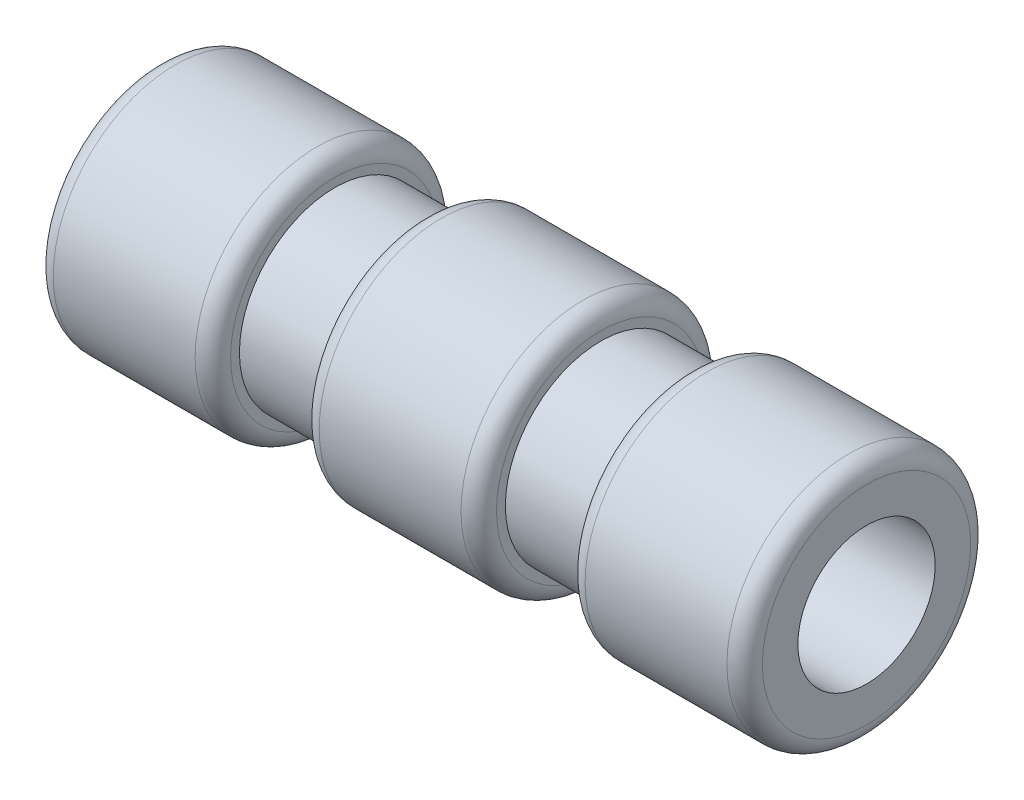
ISO-10303-21;
HEADER;
FILE_DESCRIPTION(('STEP AP214'),'2;1');
FILE_NAME('part.step','',(''),(''),'','','');
FILE_SCHEMA(('AUTOMOTIVE_DESIGN { 1 0 10303 214 1 1 1 1 }'));
ENDSEC;
DATA;
#1=APPLICATION_CONTEXT('core data for automotive mechanical design processes');
#2=APPLICATION_PROTOCOL_DEFINITION('international standard','automotive_design',2000,#1);
#3=PRODUCT_CONTEXT('',#1,'mechanical');
#4=PRODUCT('Part','Part','',(#3));
#5=PRODUCT_RELATED_PRODUCT_CATEGORY('part','',(#4));
#6=PRODUCT_DEFINITION_FORMATION('','',#4);
#7=PRODUCT_DEFINITION_CONTEXT('part definition',#1,'design');
#8=PRODUCT_DEFINITION('design','',#6,#7);
#9=PRODUCT_DEFINITION_SHAPE('','',#8);
#10=(LENGTH_UNIT() NAMED_UNIT(*) SI_UNIT(.MILLI.,.METRE.));
#11=(NAMED_UNIT(*) PLANE_ANGLE_UNIT() SI_UNIT($,.RADIAN.));
#12=(NAMED_UNIT(*) SI_UNIT($,.STERADIAN.) SOLID_ANGLE_UNIT());
#13=UNCERTAINTY_MEASURE_WITH_UNIT(LENGTH_MEASURE(1.E-05),#10,'distance_accuracy_value','');
#14=(GEOMETRIC_REPRESENTATION_CONTEXT(3) GLOBAL_UNCERTAINTY_ASSIGNED_CONTEXT((#13)) GLOBAL_UNIT_ASSIGNED_CONTEXT((#10,
#11,#12)) REPRESENTATION_CONTEXT('',''));
#15=CARTESIAN_POINT('',(0.,0.,0.));
#16=DIRECTION('',(0.,0.,1.));
#17=DIRECTION('',(1.,0.,0.));
#18=AXIS2_PLACEMENT_3D('',#15,#16,#17);
#19=CARTESIAN_POINT('',(100.,0.,-19.3760634048209));
#20=DIRECTION('',(-1.,0.,0.));
#21=DIRECTION('',(0.,0.,1.));
#22=AXIS2_PLACEMENT_3D('',#19,#20,#21);
#23=PLANE('',#22);
#24=CARTESIAN_POINT('',(100.,0.,0.));
#25=DIRECTION('',(-1.,0.,0.));
#26=DIRECTION('',(0.,0.,1.));
#27=AXIS2_PLACEMENT_3D('',#24,#25,#26);
#28=CIRCLE('',#27,29.3760634048209);
#29=CARTESIAN_POINT('',(100.,0.,29.3760634048209));
#30=VERTEX_POINT('',#29);
#31=EDGE_CURVE('E10',#30,#30,#28,.F.);
#32=ORIENTED_EDGE('',*,*,#31,.T.);
#33=EDGE_LOOP('',(#32));
#34=FACE_BOUND('',#33,.T.);
#35=CARTESIAN_POINT('',(100.,0.,0.));
#36=DIRECTION('',(-1.,0.,0.));
#37=DIRECTION('',(0.,0.,1.));
#38=AXIS2_PLACEMENT_3D('',#35,#36,#37);
#39=CIRCLE('',#38,19.3760634048209);
#40=CARTESIAN_POINT('',(100.,0.,19.3760634048209));
#41=VERTEX_POINT('',#40);
#42=EDGE_CURVE('E116',#41,#41,#39,.T.);
#43=ORIENTED_EDGE('',*,*,#42,.T.);
#44=EDGE_LOOP('',(#43));
#45=FACE_BOUND('',#44,.T.);
#46=ADVANCED_FACE('F40',(#34,#45),#23,.F.);
#47=CARTESIAN_POINT('',(-168.854447157283,0.,0.));
#48=DIRECTION('',(-1.,0.,0.));
#49=DIRECTION('',(0.,0.,1.));
#50=AXIS2_PLACEMENT_3D('',#47,#48,#49);
#51=CYLINDRICAL_SURFACE('',#50,34.3760634048209);
#52=CARTESIAN_POINT('',(55.,0.,0.));
#53=DIRECTION('',(1.,0.,0.));
#54=DIRECTION('',(0.,0.,-1.));
#55=AXIS2_PLACEMENT_3D('',#52,#53,#54);
#56=CIRCLE('',#55,34.3760634048209);
#57=CARTESIAN_POINT('',(55.,0.,-34.3760634048209));
#58=VERTEX_POINT('',#57);
#59=EDGE_CURVE('E48',#58,#58,#56,.T.);
#60=ORIENTED_EDGE('',*,*,#59,.T.);
#61=EDGE_LOOP('',(#60));
#62=FACE_BOUND('',#61,.T.);
#63=CARTESIAN_POINT('',(95.,0.,0.));
#64=DIRECTION('',(-1.,0.,0.));
#65=DIRECTION('',(0.,0.,1.));
#66=AXIS2_PLACEMENT_3D('',#63,#64,#65);
#67=CIRCLE('',#66,34.3760634048209);
#68=CARTESIAN_POINT('',(95.,0.,34.3760634048209));
#69=VERTEX_POINT('',#68);
#70=EDGE_CURVE('E53',#69,#69,#67,.T.);
#71=ORIENTED_EDGE('',*,*,#70,.T.);
#72=EDGE_LOOP('',(#71));
#73=FACE_BOUND('',#72,.T.);
#74=ADVANCED_FACE('F142',(#62,#73),#51,.T.);
#75=CARTESIAN_POINT('',(50.,0.,-34.3760634048209));
#76=DIRECTION('',(1.,0.,0.));
#77=DIRECTION('',(0.,0.,-1.));
#78=AXIS2_PLACEMENT_3D('',#75,#76,#77);
#79=PLANE('',#78);
#80=CARTESIAN_POINT('',(50.,0.,0.));
#81=DIRECTION('',(1.,0.,0.));
#82=DIRECTION('',(0.,0.,-1.));
#83=AXIS2_PLACEMENT_3D('',#80,#81,#82);
#84=CIRCLE('',#83,29.3760634048209);
#85=CARTESIAN_POINT('',(50.,0.,-29.3760634048209));
#86=VERTEX_POINT('',#85);
#87=EDGE_CURVE('E58',#86,#86,#84,.F.);
#88=ORIENTED_EDGE('',*,*,#87,.T.);
#89=EDGE_LOOP('',(#88));
#90=FACE_BOUND('',#89,.T.);
#91=CARTESIAN_POINT('',(50.,0.,0.));
#92=DIRECTION('',(-1.,0.,0.));
#93=DIRECTION('',(0.,0.,1.));
#94=AXIS2_PLACEMENT_3D('',#91,#92,#93);
#95=CIRCLE('',#94,26.8760634048209);
#96=CARTESIAN_POINT('',(50.,0.,26.8760634048209));
#97=VERTEX_POINT('',#96);
#98=EDGE_CURVE('E96',#97,#97,#95,.T.);
#99=ORIENTED_EDGE('',*,*,#98,.F.);
#100=EDGE_LOOP('',(#99));
#101=FACE_BOUND('',#100,.T.);
#102=ADVANCED_FACE('F148',(#90,#101),#79,.F.);
#103=CARTESIAN_POINT('',(-168.854447157283,0.,0.));
#104=DIRECTION('',(-1.,0.,0.));
#105=DIRECTION('',(0.,0.,1.));
#106=AXIS2_PLACEMENT_3D('',#103,#104,#105);
#107=CYLINDRICAL_SURFACE('',#106,26.8760634048209);
#108=CARTESIAN_POINT('',(25.,0.,0.));
#109=DIRECTION('',(-1.,0.,0.));
#110=DIRECTION('',(0.,0.,1.));
#111=AXIS2_PLACEMENT_3D('',#108,#109,#110);
#112=CIRCLE('',#111,26.8760634048209);
#113=CARTESIAN_POINT('',(25.,0.,26.8760634048209));
#114=VERTEX_POINT('',#113);
#115=EDGE_CURVE('E100',#114,#114,#112,.T.);
#116=ORIENTED_EDGE('',*,*,#115,.F.);
#117=EDGE_LOOP('',(#116));
#118=FACE_BOUND('',#117,.T.);
#119=ORIENTED_EDGE('',*,*,#98,.T.);
#120=EDGE_LOOP('',(#119));
#121=FACE_BOUND('',#120,.T.);
#122=ADVANCED_FACE('F178',(#118,#121),#107,.T.);
#123=CARTESIAN_POINT('',(25.,0.,-26.8760634048209));
#124=DIRECTION('',(-1.,0.,0.));
#125=DIRECTION('',(0.,0.,1.));
#126=AXIS2_PLACEMENT_3D('',#123,#124,#125);
#127=PLANE('',#126);
#128=CARTESIAN_POINT('',(25.,0.,0.));
#129=DIRECTION('',(-1.,0.,0.));
#130=DIRECTION('',(0.,0.,1.));
#131=AXIS2_PLACEMENT_3D('',#128,#129,#130);
#132=CIRCLE('',#131,29.3760634048209);
#133=CARTESIAN_POINT('',(25.,0.,29.3760634048209));
#134=VERTEX_POINT('',#133);
#135=EDGE_CURVE('E64',#134,#134,#132,.F.);
#136=ORIENTED_EDGE('',*,*,#135,.T.);
#137=EDGE_LOOP('',(#136));
#138=FACE_BOUND('',#137,.T.);
#139=ORIENTED_EDGE('',*,*,#115,.T.);
#140=EDGE_LOOP('',(#139));
#141=FACE_BOUND('',#140,.T.);
#142=ADVANCED_FACE('F182',(#138,#141),#127,.F.);
#143=CARTESIAN_POINT('',(-168.854447157283,0.,0.));
#144=DIRECTION('',(-1.,0.,0.));
#145=DIRECTION('',(0.,0.,1.));
#146=AXIS2_PLACEMENT_3D('',#143,#144,#145);
#147=CYLINDRICAL_SURFACE('',#146,34.3760634048209);
#148=CARTESIAN_POINT('',(-20.,0.,0.));
#149=DIRECTION('',(1.,0.,0.));
#150=DIRECTION('',(0.,0.,-1.));
#151=AXIS2_PLACEMENT_3D('',#148,#149,#150);
#152=CIRCLE('',#151,34.3760634048209);
#153=CARTESIAN_POINT('',(-20.,0.,-34.3760634048209));
#154=VERTEX_POINT('',#153);
#155=EDGE_CURVE('E68',#154,#154,#152,.T.);
#156=ORIENTED_EDGE('',*,*,#155,.T.);
#157=EDGE_LOOP('',(#156));
#158=FACE_BOUND('',#157,.T.);
#159=CARTESIAN_POINT('',(20.,0.,0.));
#160=DIRECTION('',(-1.,0.,0.));
#161=DIRECTION('',(0.,0.,1.));
#162=AXIS2_PLACEMENT_3D('',#159,#160,#161);
#163=CIRCLE('',#162,34.3760634048209);
#164=CARTESIAN_POINT('',(20.,0.,34.3760634048209));
#165=VERTEX_POINT('',#164);
#166=EDGE_CURVE('E72',#165,#165,#163,.T.);
#167=ORIENTED_EDGE('',*,*,#166,.T.);
#168=EDGE_LOOP('',(#167));
#169=FACE_BOUND('',#168,.T.);
#170=ADVANCED_FACE('F190',(#158,#169),#147,.T.);
#171=CARTESIAN_POINT('',(-25.,0.,-26.8760634048209));
#172=DIRECTION('',(1.,0.,0.));
#173=DIRECTION('',(0.,0.,-1.));
#174=AXIS2_PLACEMENT_3D('',#171,#172,#173);
#175=PLANE('',#174);
#176=CARTESIAN_POINT('',(-25.,0.,0.));
#177=DIRECTION('',(1.,0.,0.));
#178=DIRECTION('',(0.,0.,-1.));
#179=AXIS2_PLACEMENT_3D('',#176,#177,#178);
#180=CIRCLE('',#179,29.3760634048209);
#181=CARTESIAN_POINT('',(-25.,0.,-29.3760634048209));
#182=VERTEX_POINT('',#181);
#183=EDGE_CURVE('E76',#182,#182,#180,.F.);
#184=ORIENTED_EDGE('',*,*,#183,.T.);
#185=EDGE_LOOP('',(#184));
#186=FACE_BOUND('',#185,.T.);
#187=CARTESIAN_POINT('',(-25.,0.,0.));
#188=DIRECTION('',(-1.,0.,0.));
#189=DIRECTION('',(0.,0.,1.));
#190=AXIS2_PLACEMENT_3D('',#187,#188,#189);
#191=CIRCLE('',#190,26.8760634048209);
#192=CARTESIAN_POINT('',(-25.,0.,26.8760634048209));
#193=VERTEX_POINT('',#192);
#194=EDGE_CURVE('E104',#193,#193,#191,.T.);
#195=ORIENTED_EDGE('',*,*,#194,.F.);
#196=EDGE_LOOP('',(#195));
#197=FACE_BOUND('',#196,.T.);
#198=ADVANCED_FACE('F197',(#186,#197),#175,.F.);
#199=CARTESIAN_POINT('',(-168.854447157283,0.,0.));
#200=DIRECTION('',(-1.,0.,0.));
#201=DIRECTION('',(0.,0.,1.));
#202=AXIS2_PLACEMENT_3D('',#199,#200,#201);
#203=CYLINDRICAL_SURFACE('',#202,26.8760634048209);
#204=CARTESIAN_POINT('',(-50.,0.,0.));
#205=DIRECTION('',(-1.,0.,0.));
#206=DIRECTION('',(0.,0.,1.));
#207=AXIS2_PLACEMENT_3D('',#204,#205,#206);
#208=CIRCLE('',#207,26.8760634048209);
#209=CARTESIAN_POINT('',(-50.,0.,26.8760634048209));
#210=VERTEX_POINT('',#209);
#211=EDGE_CURVE('E108',#210,#210,#208,.T.);
#212=ORIENTED_EDGE('',*,*,#211,.F.);
#213=EDGE_LOOP('',(#212));
#214=FACE_BOUND('',#213,.T.);
#215=ORIENTED_EDGE('',*,*,#194,.T.);
#216=EDGE_LOOP('',(#215));
#217=FACE_BOUND('',#216,.T.);
#218=ADVANCED_FACE('F201',(#214,#217),#203,.T.);
#219=CARTESIAN_POINT('',(-50.,0.,-34.3760634048209));
#220=DIRECTION('',(-1.,0.,0.));
#221=DIRECTION('',(0.,0.,1.));
#222=AXIS2_PLACEMENT_3D('',#219,#220,#221);
#223=PLANE('',#222);
#224=CARTESIAN_POINT('',(-50.,0.,0.));
#225=DIRECTION('',(-1.,0.,0.));
#226=DIRECTION('',(0.,0.,1.));
#227=AXIS2_PLACEMENT_3D('',#224,#225,#226);
#228=CIRCLE('',#227,29.3760634048209);
#229=CARTESIAN_POINT('',(-50.,0.,29.3760634048209));
#230=VERTEX_POINT('',#229);
#231=EDGE_CURVE('E84',#230,#230,#228,.F.);
#232=ORIENTED_EDGE('',*,*,#231,.T.);
#233=EDGE_LOOP('',(#232));
#234=FACE_BOUND('',#233,.T.);
#235=ORIENTED_EDGE('',*,*,#211,.T.);
#236=EDGE_LOOP('',(#235));
#237=FACE_BOUND('',#236,.T.);
#238=ADVANCED_FACE('F138',(#234,#237),#223,.F.);
#239=CARTESIAN_POINT('',(-168.854447157283,0.,0.));
#240=DIRECTION('',(-1.,0.,0.));
#241=DIRECTION('',(0.,0.,1.));
#242=AXIS2_PLACEMENT_3D('',#239,#240,#241);
#243=CYLINDRICAL_SURFACE('',#242,34.3760634048209);
#244=CARTESIAN_POINT('',(-55.,0.,0.));
#245=DIRECTION('',(-1.,0.,0.));
#246=DIRECTION('',(0.,0.,1.));
#247=AXIS2_PLACEMENT_3D('',#244,#245,#246);
#248=CIRCLE('',#247,34.3760634048209);
#249=CARTESIAN_POINT('',(-55.,0.,34.3760634048209));
#250=VERTEX_POINT('',#249);
#251=EDGE_CURVE('E88',#250,#250,#248,.T.);
#252=ORIENTED_EDGE('',*,*,#251,.T.);
#253=EDGE_LOOP('',(#252));
#254=FACE_BOUND('',#253,.T.);
#255=CARTESIAN_POINT('',(-95.,0.,0.));
#256=DIRECTION('',(1.,0.,0.));
#257=DIRECTION('',(0.,0.,-1.));
#258=AXIS2_PLACEMENT_3D('',#255,#256,#257);
#259=CIRCLE('',#258,34.3760634048209);
#260=CARTESIAN_POINT('',(-95.,0.,-34.3760634048209));
#261=VERTEX_POINT('',#260);
#262=EDGE_CURVE('E92',#261,#261,#259,.T.);
#263=ORIENTED_EDGE('',*,*,#262,.T.);
#264=EDGE_LOOP('',(#263));
#265=FACE_BOUND('',#264,.T.);
#266=ADVANCED_FACE('F131',(#254,#265),#243,.T.);
#267=CARTESIAN_POINT('',(-100.,0.,-19.3760634048209));
#268=DIRECTION('',(1.,0.,0.));
#269=DIRECTION('',(0.,0.,-1.));
#270=AXIS2_PLACEMENT_3D('',#267,#268,#269);
#271=PLANE('',#270);
#272=CARTESIAN_POINT('',(-100.,0.,0.));
#273=DIRECTION('',(1.,0.,0.));
#274=DIRECTION('',(0.,0.,-1.));
#275=AXIS2_PLACEMENT_3D('',#272,#273,#274);
#276=CIRCLE('',#275,29.3760634048209);
#277=CARTESIAN_POINT('',(-100.,0.,-29.3760634048209));
#278=VERTEX_POINT('',#277);
#279=EDGE_CURVE('E80',#278,#278,#276,.F.);
#280=ORIENTED_EDGE('',*,*,#279,.T.);
#281=EDGE_LOOP('',(#280));
#282=FACE_BOUND('',#281,.T.);
#283=CARTESIAN_POINT('',(-100.,0.,0.));
#284=DIRECTION('',(-1.,0.,0.));
#285=DIRECTION('',(0.,0.,1.));
#286=AXIS2_PLACEMENT_3D('',#283,#284,#285);
#287=CIRCLE('',#286,19.3760634048209);
#288=CARTESIAN_POINT('',(-100.,0.,19.3760634048209));
#289=VERTEX_POINT('',#288);
#290=EDGE_CURVE('E112',#289,#289,#287,.T.);
#291=ORIENTED_EDGE('',*,*,#290,.F.);
#292=EDGE_LOOP('',(#291));
#293=FACE_BOUND('',#292,.T.);
#294=ADVANCED_FACE('F126',(#282,#293),#271,.F.);
#295=CARTESIAN_POINT('',(-168.854447157283,0.,0.));
#296=DIRECTION('',(-1.,0.,0.));
#297=DIRECTION('',(0.,0.,1.));
#298=AXIS2_PLACEMENT_3D('',#295,#296,#297);
#299=CYLINDRICAL_SURFACE('',#298,19.3760634048209);
#300=ORIENTED_EDGE('',*,*,#42,.F.);
#301=EDGE_LOOP('',(#300));
#302=FACE_BOUND('',#301,.T.);
#303=ORIENTED_EDGE('',*,*,#290,.T.);
#304=EDGE_LOOP('',(#303));
#305=FACE_BOUND('',#304,.T.);
#306=ADVANCED_FACE('F122',(#302,#305),#299,.F.);
#307=CARTESIAN_POINT('',(-55.,0.,0.));
#308=DIRECTION('',(-1.,0.,0.));
#309=DIRECTION('',(0.,0.,1.));
#310=AXIS2_PLACEMENT_3D('',#307,#308,#309);
#311=TOROIDAL_SURFACE('',#310,29.3760634048209,5.);
#312=ORIENTED_EDGE('',*,*,#231,.F.);
#313=EDGE_LOOP('',(#312));
#314=FACE_BOUND('',#313,.T.);
#315=ORIENTED_EDGE('',*,*,#251,.F.);
#316=EDGE_LOOP('',(#315));
#317=FACE_BOUND('',#316,.T.);
#318=ADVANCED_FACE('F125',(#314,#317),#311,.T.);
#319=CARTESIAN_POINT('',(-95.,0.,0.));
#320=DIRECTION('',(1.,0.,0.));
#321=DIRECTION('',(0.,0.,-1.));
#322=AXIS2_PLACEMENT_3D('',#319,#320,#321);
#323=TOROIDAL_SURFACE('',#322,29.3760634048209,5.);
#324=ORIENTED_EDGE('',*,*,#262,.F.);
#325=EDGE_LOOP('',(#324));
#326=FACE_BOUND('',#325,.T.);
#327=ORIENTED_EDGE('',*,*,#279,.F.);
#328=EDGE_LOOP('',(#327));
#329=FACE_BOUND('',#328,.T.);
#330=ADVANCED_FACE('F154',(#326,#329),#323,.T.);
#331=CARTESIAN_POINT('',(-20.,0.,0.));
#332=DIRECTION('',(1.,0.,0.));
#333=DIRECTION('',(0.,0.,-1.));
#334=AXIS2_PLACEMENT_3D('',#331,#332,#333);
#335=TOROIDAL_SURFACE('',#334,29.3760634048209,5.);
#336=ORIENTED_EDGE('',*,*,#155,.F.);
#337=EDGE_LOOP('',(#336));
#338=FACE_BOUND('',#337,.T.);
#339=ORIENTED_EDGE('',*,*,#183,.F.);
#340=EDGE_LOOP('',(#339));
#341=FACE_BOUND('',#340,.T.);
#342=ADVANCED_FACE('F158',(#338,#341),#335,.T.);
#343=CARTESIAN_POINT('',(20.,0.,0.));
#344=DIRECTION('',(-1.,0.,0.));
#345=DIRECTION('',(0.,0.,1.));
#346=AXIS2_PLACEMENT_3D('',#343,#344,#345);
#347=TOROIDAL_SURFACE('',#346,29.3760634048209,5.);
#348=ORIENTED_EDGE('',*,*,#135,.F.);
#349=EDGE_LOOP('',(#348));
#350=FACE_BOUND('',#349,.T.);
#351=ORIENTED_EDGE('',*,*,#166,.F.);
#352=EDGE_LOOP('',(#351));
#353=FACE_BOUND('',#352,.T.);
#354=ADVANCED_FACE('F162',(#350,#353),#347,.T.);
#355=CARTESIAN_POINT('',(55.,0.,0.));
#356=DIRECTION('',(1.,0.,0.));
#357=DIRECTION('',(0.,0.,-1.));
#358=AXIS2_PLACEMENT_3D('',#355,#356,#357);
#359=TOROIDAL_SURFACE('',#358,29.3760634048209,5.);
#360=ORIENTED_EDGE('',*,*,#59,.F.);
#361=EDGE_LOOP('',(#360));
#362=FACE_BOUND('',#361,.T.);
#363=ORIENTED_EDGE('',*,*,#87,.F.);
#364=EDGE_LOOP('',(#363));
#365=FACE_BOUND('',#364,.T.);
#366=ADVANCED_FACE('F165',(#362,#365),#359,.T.);
#367=CARTESIAN_POINT('',(95.,0.,0.));
#368=DIRECTION('',(-1.,0.,0.));
#369=DIRECTION('',(0.,0.,1.));
#370=AXIS2_PLACEMENT_3D('',#367,#368,#369);
#371=TOROIDAL_SURFACE('',#370,29.3760634048209,5.);
#372=ORIENTED_EDGE('',*,*,#31,.F.);
#373=EDGE_LOOP('',(#372));
#374=FACE_BOUND('',#373,.T.);
#375=ORIENTED_EDGE('',*,*,#70,.F.);
#376=EDGE_LOOP('',(#375));
#377=FACE_BOUND('',#376,.T.);
#378=ADVANCED_FACE('F42',(#374,#377),#371,.T.);
#379=CLOSED_SHELL('',(#46,#74,#102,#122,#142,#170,#198,#218,#238,#266,#294,#306,#318,#330,#342,
#354,#366,#378));
#380=MANIFOLD_SOLID_BREP('B2',#379);
#381=ADVANCED_BREP_SHAPE_REPRESENTATION('',(#18,#380),#14);
#382=SHAPE_DEFINITION_REPRESENTATION(#9,#381);
ENDSEC;
END-ISO-10303-21;
